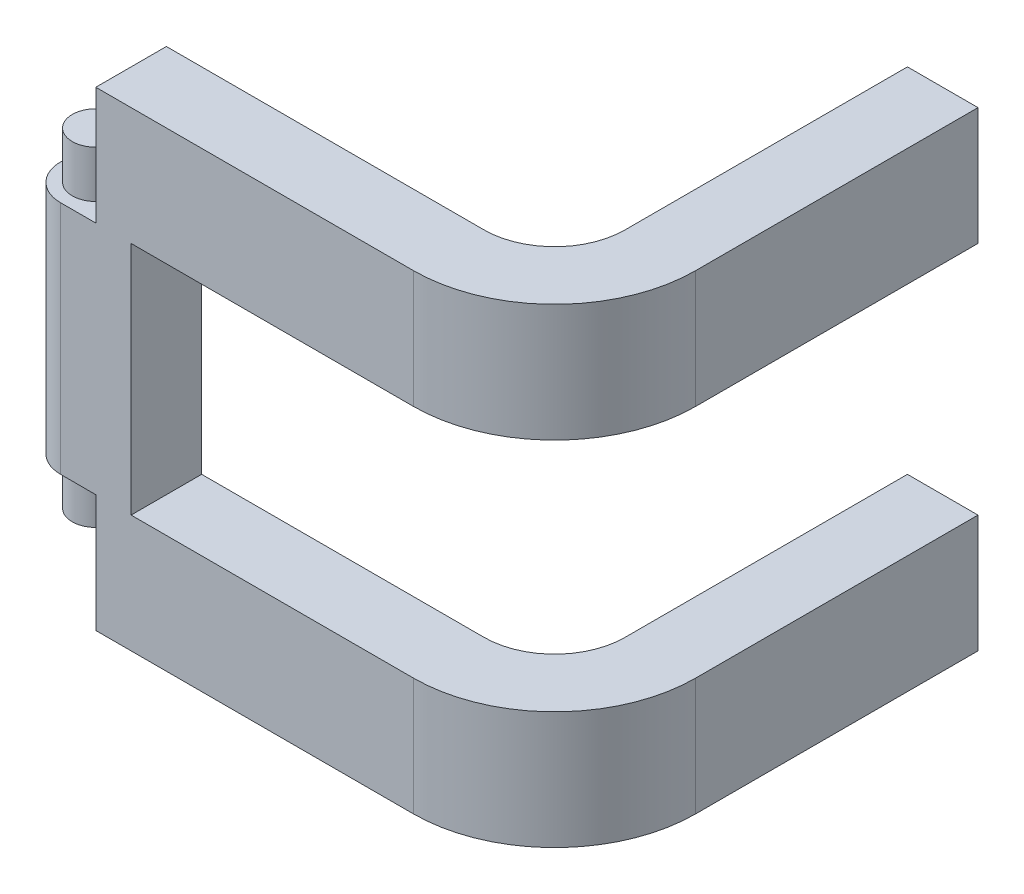
ISO-10303-21;
HEADER;
FILE_DESCRIPTION(('STEP AP214'),'2;1');
FILE_NAME('part.step','',(''),(''),'','','');
FILE_SCHEMA(('AUTOMOTIVE_DESIGN { 1 0 10303 214 1 1 1 1 }'));
ENDSEC;
DATA;
#1=APPLICATION_CONTEXT('core data for automotive mechanical design processes');
#2=APPLICATION_PROTOCOL_DEFINITION('international standard','automotive_design',2000,#1);
#3=PRODUCT_CONTEXT('',#1,'mechanical');
#4=PRODUCT('Part','Part','',(#3));
#5=PRODUCT_RELATED_PRODUCT_CATEGORY('part','',(#4));
#6=PRODUCT_DEFINITION_FORMATION('','',#4);
#7=PRODUCT_DEFINITION_CONTEXT('part definition',#1,'design');
#8=PRODUCT_DEFINITION('design','',#6,#7);
#9=PRODUCT_DEFINITION_SHAPE('','',#8);
#10=(LENGTH_UNIT() NAMED_UNIT(*) SI_UNIT(.MILLI.,.METRE.));
#11=(NAMED_UNIT(*) PLANE_ANGLE_UNIT() SI_UNIT($,.RADIAN.));
#12=(NAMED_UNIT(*) SI_UNIT($,.STERADIAN.) SOLID_ANGLE_UNIT());
#13=UNCERTAINTY_MEASURE_WITH_UNIT(LENGTH_MEASURE(1.E-05),#10,'distance_accuracy_value','');
#14=(GEOMETRIC_REPRESENTATION_CONTEXT(3) GLOBAL_UNCERTAINTY_ASSIGNED_CONTEXT((#13)) GLOBAL_UNIT_ASSIGNED_CONTEXT((#10,
#11,#12)) REPRESENTATION_CONTEXT('',''));
#15=CARTESIAN_POINT('',(0.,0.,0.));
#16=DIRECTION('',(0.,0.,1.));
#17=DIRECTION('',(1.,0.,0.));
#18=AXIS2_PLACEMENT_3D('',#15,#16,#17);
#19=CARTESIAN_POINT('',(0.,50.,0.));
#20=DIRECTION('',(0.,-1.,0.));
#21=DIRECTION('',(0.,0.,-1.));
#22=AXIS2_PLACEMENT_3D('',#19,#20,#21);
#23=CYLINDRICAL_SURFACE('',#22,7.5);
#24=CARTESIAN_POINT('',(0.,-25.,0.));
#25=DIRECTION('',(0.,1.,0.));
#26=DIRECTION('',(0.,0.,1.));
#27=AXIS2_PLACEMENT_3D('',#24,#25,#26);
#28=CIRCLE('',#27,7.5);
#29=CARTESIAN_POINT('',(0.,-25.,-7.5));
#30=VERTEX_POINT('',#29);
#31=CARTESIAN_POINT('',(0.,-25.,7.5));
#32=VERTEX_POINT('',#31);
#33=EDGE_CURVE('E177',#30,#32,#28,.T.);
#34=ORIENTED_EDGE('',*,*,#33,.T.);
#35=DIRECTION('',(0.,-1.,0.));
#36=VECTOR('',#35,1.);
#37=CARTESIAN_POINT('',(0.,50.,7.5));
#38=LINE('',#37,#36);
#39=CARTESIAN_POINT('',(0.,25.,7.5));
#40=VERTEX_POINT('',#39);
#41=EDGE_CURVE('E245',#40,#32,#38,.T.);
#42=ORIENTED_EDGE('',*,*,#41,.F.);
#43=CARTESIAN_POINT('',(0.,25.,0.));
#44=DIRECTION('',(0.,1.,0.));
#45=DIRECTION('',(0.,0.,1.));
#46=AXIS2_PLACEMENT_3D('',#43,#44,#45);
#47=CIRCLE('',#46,7.5);
#48=CARTESIAN_POINT('',(0.,25.,-7.5));
#49=VERTEX_POINT('',#48);
#50=EDGE_CURVE('E202',#49,#40,#47,.T.);
#51=ORIENTED_EDGE('',*,*,#50,.F.);
#52=DIRECTION('',(0.,-1.,0.));
#53=VECTOR('',#52,1.);
#54=CARTESIAN_POINT('',(0.,50.,-7.5));
#55=LINE('',#54,#53);
#56=EDGE_CURVE('E196',#49,#30,#55,.T.);
#57=ORIENTED_EDGE('',*,*,#56,.T.);
#58=EDGE_LOOP('',(#34,#42,#51,#57));
#59=FACE_BOUND('',#58,.T.);
#60=ADVANCED_FACE('F41',(#59),#23,.T.);
#61=CARTESIAN_POINT('',(0.,50.,7.5));
#62=DIRECTION('',(0.,0.,-1.));
#63=DIRECTION('',(-1.,0.,0.));
#64=AXIS2_PLACEMENT_3D('',#61,#62,#63);
#65=PLANE('',#64);
#66=DIRECTION('',(1.,0.,0.));
#67=VECTOR('',#66,1.);
#68=CARTESIAN_POINT('',(7.5,-25.,7.5));
#69=LINE('',#68,#67);
#70=CARTESIAN_POINT('',(7.5,-25.,7.5));
#71=VERTEX_POINT('',#70);
#72=EDGE_CURVE('E184',#32,#71,#69,.T.);
#73=ORIENTED_EDGE('',*,*,#72,.T.);
#74=DIRECTION('',(0.,-1.,0.));
#75=VECTOR('',#74,1.);
#76=CARTESIAN_POINT('',(7.5,-35.,7.5));
#77=LINE('',#76,#75);
#78=CARTESIAN_POINT('',(7.5,-50.,7.5));
#79=VERTEX_POINT('',#78);
#80=EDGE_CURVE('E370',#71,#79,#77,.T.);
#81=ORIENTED_EDGE('',*,*,#80,.T.);
#82=DIRECTION('',(1.,0.,0.));
#83=VECTOR('',#82,1.);
#84=CARTESIAN_POINT('',(0.,-50.,7.5));
#85=LINE('',#84,#83);
#86=CARTESIAN_POINT('',(75.,-50.,7.5));
#87=VERTEX_POINT('',#86);
#88=EDGE_CURVE('E316',#79,#87,#85,.T.);
#89=ORIENTED_EDGE('',*,*,#88,.T.);
#90=DIRECTION('',(0.,-1.,0.));
#91=VECTOR('',#90,1.);
#92=CARTESIAN_POINT('',(75.,50.,7.5));
#93=LINE('',#92,#91);
#94=CARTESIAN_POINT('',(75.,-25.,7.5));
#95=VERTEX_POINT('',#94);
#96=EDGE_CURVE('E240',#95,#87,#93,.T.);
#97=ORIENTED_EDGE('',*,*,#96,.F.);
#98=DIRECTION('',(1.,0.,0.));
#99=VECTOR('',#98,1.);
#100=CARTESIAN_POINT('',(0.,-25.,7.5));
#101=LINE('',#100,#99);
#102=CARTESIAN_POINT('',(15.,-25.,7.5));
#103=VERTEX_POINT('',#102);
#104=EDGE_CURVE('E293',#103,#95,#101,.T.);
#105=ORIENTED_EDGE('',*,*,#104,.F.);
#106=DIRECTION('',(0.,1.,0.));
#107=VECTOR('',#106,1.);
#108=CARTESIAN_POINT('',(15.,50.,7.5));
#109=LINE('',#108,#107);
#110=CARTESIAN_POINT('',(15.,25.,7.5));
#111=VERTEX_POINT('',#110);
#112=EDGE_CURVE('E313',#103,#111,#109,.T.);
#113=ORIENTED_EDGE('',*,*,#112,.T.);
#114=DIRECTION('',(-1.,0.,0.));
#115=VECTOR('',#114,1.);
#116=CARTESIAN_POINT('',(0.,25.,7.5));
#117=LINE('',#116,#115);
#118=CARTESIAN_POINT('',(75.,25.,7.5));
#119=VERTEX_POINT('',#118);
#120=EDGE_CURVE('E268',#119,#111,#117,.T.);
#121=ORIENTED_EDGE('',*,*,#120,.F.);
#122=CARTESIAN_POINT('',(75.,50.,7.5));
#123=VERTEX_POINT('',#122);
#124=EDGE_CURVE('E241',#123,#119,#93,.T.);
#125=ORIENTED_EDGE('',*,*,#124,.F.);
#126=DIRECTION('',(1.,0.,0.));
#127=VECTOR('',#126,1.);
#128=CARTESIAN_POINT('',(0.,50.,7.5));
#129=LINE('',#128,#127);
#130=CARTESIAN_POINT('',(7.5,50.,7.5));
#131=VERTEX_POINT('',#130);
#132=EDGE_CURVE('E317',#131,#123,#129,.T.);
#133=ORIENTED_EDGE('',*,*,#132,.F.);
#134=DIRECTION('',(0.,1.,0.));
#135=VECTOR('',#134,1.);
#136=CARTESIAN_POINT('',(7.5,35.,7.5));
#137=LINE('',#136,#135);
#138=CARTESIAN_POINT('',(7.5,25.,7.5));
#139=VERTEX_POINT('',#138);
#140=EDGE_CURVE('E64',#139,#131,#137,.T.);
#141=ORIENTED_EDGE('',*,*,#140,.F.);
#142=DIRECTION('',(1.,0.,0.));
#143=VECTOR('',#142,1.);
#144=CARTESIAN_POINT('',(7.5,25.,7.5));
#145=LINE('',#144,#143);
#146=EDGE_CURVE('E419',#40,#139,#145,.T.);
#147=ORIENTED_EDGE('',*,*,#146,.F.);
#148=ORIENTED_EDGE('',*,*,#41,.T.);
#149=EDGE_LOOP('',(#73,#81,#89,#97,#105,#113,#121,#125,#133,#141,#147,#148));
#150=FACE_BOUND('',#149,.T.);
#151=ADVANCED_FACE('F388',(#150),#65,.F.);
#152=CARTESIAN_POINT('',(0.,50.,-7.5));
#153=DIRECTION('',(0.,0.,1.));
#154=DIRECTION('',(1.,0.,0.));
#155=AXIS2_PLACEMENT_3D('',#152,#153,#154);
#156=PLANE('',#155);
#157=DIRECTION('',(-1.,0.,0.));
#158=VECTOR('',#157,1.);
#159=CARTESIAN_POINT('',(0.,-25.,-7.5));
#160=LINE('',#159,#158);
#161=CARTESIAN_POINT('',(7.5,-25.,-7.5));
#162=VERTEX_POINT('',#161);
#163=EDGE_CURVE('E182',#162,#30,#160,.T.);
#164=ORIENTED_EDGE('',*,*,#163,.T.);
#165=ORIENTED_EDGE('',*,*,#56,.F.);
#166=DIRECTION('',(-1.,0.,0.));
#167=VECTOR('',#166,1.);
#168=CARTESIAN_POINT('',(0.,25.,-7.5));
#169=LINE('',#168,#167);
#170=CARTESIAN_POINT('',(7.5,25.,-7.5));
#171=VERTEX_POINT('',#170);
#172=EDGE_CURVE('E366',#171,#49,#169,.T.);
#173=ORIENTED_EDGE('',*,*,#172,.F.);
#174=DIRECTION('',(0.,1.,0.));
#175=VECTOR('',#174,1.);
#176=CARTESIAN_POINT('',(7.49999999999999,35.,-7.5));
#177=LINE('',#176,#175);
#178=CARTESIAN_POINT('',(7.49999999999999,50.,-7.5));
#179=VERTEX_POINT('',#178);
#180=EDGE_CURVE('E270',#171,#179,#177,.T.);
#181=ORIENTED_EDGE('',*,*,#180,.T.);
#182=DIRECTION('',(-1.,0.,0.));
#183=VECTOR('',#182,1.);
#184=CARTESIAN_POINT('',(0.,50.,-7.5));
#185=LINE('',#184,#183);
#186=CARTESIAN_POINT('',(75.,50.,-7.5));
#187=VERTEX_POINT('',#186);
#188=EDGE_CURVE('E205',#187,#179,#185,.T.);
#189=ORIENTED_EDGE('',*,*,#188,.F.);
#190=DIRECTION('',(0.,-1.,0.));
#191=VECTOR('',#190,1.);
#192=CARTESIAN_POINT('',(75.,50.,-7.5));
#193=LINE('',#192,#191);
#194=CARTESIAN_POINT('',(75.,25.,-7.5));
#195=VERTEX_POINT('',#194);
#196=EDGE_CURVE('E209',#187,#195,#193,.T.);
#197=ORIENTED_EDGE('',*,*,#196,.T.);
#198=DIRECTION('',(1.,0.,0.));
#199=VECTOR('',#198,1.);
#200=CARTESIAN_POINT('',(0.,25.,-7.5));
#201=LINE('',#200,#199);
#202=CARTESIAN_POINT('',(15.,25.,-7.5));
#203=VERTEX_POINT('',#202);
#204=EDGE_CURVE('E11',#203,#195,#201,.T.);
#205=ORIENTED_EDGE('',*,*,#204,.F.);
#206=DIRECTION('',(0.,-1.,0.));
#207=VECTOR('',#206,1.);
#208=CARTESIAN_POINT('',(15.,50.,-7.5));
#209=LINE('',#208,#207);
#210=CARTESIAN_POINT('',(15.,-25.,-7.5));
#211=VERTEX_POINT('',#210);
#212=EDGE_CURVE('E49',#203,#211,#209,.T.);
#213=ORIENTED_EDGE('',*,*,#212,.T.);
#214=DIRECTION('',(-1.,0.,0.));
#215=VECTOR('',#214,1.);
#216=CARTESIAN_POINT('',(0.,-25.,-7.5));
#217=LINE('',#216,#215);
#218=CARTESIAN_POINT('',(75.,-25.,-7.5));
#219=VERTEX_POINT('',#218);
#220=EDGE_CURVE('E248',#219,#211,#217,.T.);
#221=ORIENTED_EDGE('',*,*,#220,.F.);
#222=CARTESIAN_POINT('',(75.,-50.,-7.5));
#223=VERTEX_POINT('',#222);
#224=EDGE_CURVE('E204',#219,#223,#193,.T.);
#225=ORIENTED_EDGE('',*,*,#224,.T.);
#226=DIRECTION('',(-1.,0.,0.));
#227=VECTOR('',#226,1.);
#228=CARTESIAN_POINT('',(0.,-50.,-7.5));
#229=LINE('',#228,#227);
#230=CARTESIAN_POINT('',(7.49999999999999,-50.,-7.5));
#231=VERTEX_POINT('',#230);
#232=EDGE_CURVE('E215',#223,#231,#229,.T.);
#233=ORIENTED_EDGE('',*,*,#232,.T.);
#234=DIRECTION('',(0.,-1.,0.));
#235=VECTOR('',#234,1.);
#236=CARTESIAN_POINT('',(7.49999999999999,-35.,-7.5));
#237=LINE('',#236,#235);
#238=EDGE_CURVE('E56',#162,#231,#237,.T.);
#239=ORIENTED_EDGE('',*,*,#238,.F.);
#240=EDGE_LOOP('',(#164,#165,#173,#181,#189,#197,#205,#213,#221,#225,#233,#239));
#241=FACE_BOUND('',#240,.T.);
#242=ADVANCED_FACE('F194',(#241),#156,.F.);
#243=CARTESIAN_POINT('',(0.,50.,0.));
#244=DIRECTION('',(0.,1.,0.));
#245=DIRECTION('',(0.,0.,1.));
#246=AXIS2_PLACEMENT_3D('',#243,#244,#245);
#247=PLANE('',#246);
#248=ORIENTED_EDGE('',*,*,#188,.T.);
#249=DIRECTION('',(0.,0.,1.));
#250=VECTOR('',#249,1.);
#251=CARTESIAN_POINT('',(7.49999999999999,50.,-7.5));
#252=LINE('',#251,#250);
#253=EDGE_CURVE('E378',#179,#131,#252,.T.);
#254=ORIENTED_EDGE('',*,*,#253,.T.);
#255=ORIENTED_EDGE('',*,*,#132,.T.);
#256=CARTESIAN_POINT('',(75.,50.,-22.5));
#257=DIRECTION('',(0.,1.,0.));
#258=DIRECTION('',(0.,0.,1.));
#259=AXIS2_PLACEMENT_3D('',#256,#257,#258);
#260=CIRCLE('',#259,30.);
#261=CARTESIAN_POINT('',(105.,50.,-22.5));
#262=VERTEX_POINT('',#261);
#263=EDGE_CURVE('E320',#123,#262,#260,.T.);
#264=ORIENTED_EDGE('',*,*,#263,.T.);
#265=DIRECTION('',(0.,0.,-1.));
#266=VECTOR('',#265,1.);
#267=CARTESIAN_POINT('',(105.,50.,-22.5));
#268=LINE('',#267,#266);
#269=CARTESIAN_POINT('',(105.,50.,-82.5));
#270=VERTEX_POINT('',#269);
#271=EDGE_CURVE('E323',#262,#270,#268,.T.);
#272=ORIENTED_EDGE('',*,*,#271,.T.);
#273=DIRECTION('',(-1.,0.,0.));
#274=VECTOR('',#273,1.);
#275=CARTESIAN_POINT('',(90.,50.,-82.5));
#276=LINE('',#275,#274);
#277=CARTESIAN_POINT('',(90.,50.,-82.5));
#278=VERTEX_POINT('',#277);
#279=EDGE_CURVE('E326',#270,#278,#276,.T.);
#280=ORIENTED_EDGE('',*,*,#279,.T.);
#281=DIRECTION('',(0.,0.,1.));
#282=VECTOR('',#281,1.);
#283=CARTESIAN_POINT('',(90.,50.,-22.5));
#284=LINE('',#283,#282);
#285=CARTESIAN_POINT('',(90.,50.,-22.5));
#286=VERTEX_POINT('',#285);
#287=EDGE_CURVE('E329',#278,#286,#284,.T.);
#288=ORIENTED_EDGE('',*,*,#287,.T.);
#289=CARTESIAN_POINT('',(75.,50.,-22.5));
#290=DIRECTION('',(0.,-1.,0.));
#291=DIRECTION('',(0.,0.,1.));
#292=AXIS2_PLACEMENT_3D('',#289,#290,#291);
#293=CIRCLE('',#292,15.);
#294=EDGE_CURVE('E212',#286,#187,#293,.T.);
#295=ORIENTED_EDGE('',*,*,#294,.T.);
#296=EDGE_LOOP('',(#248,#254,#255,#264,#272,#280,#288,#295));
#297=FACE_BOUND('',#296,.T.);
#298=ADVANCED_FACE('F384',(#297),#247,.T.);
#299=CARTESIAN_POINT('',(75.,50.,-22.5));
#300=DIRECTION('',(0.,-1.,0.));
#301=DIRECTION('',(0.,0.,-1.));
#302=AXIS2_PLACEMENT_3D('',#299,#300,#301);
#303=CYLINDRICAL_SURFACE('',#302,30.);
#304=CARTESIAN_POINT('',(75.,25.,-22.5));
#305=DIRECTION('',(0.,-1.,0.));
#306=DIRECTION('',(0.,0.,-1.));
#307=AXIS2_PLACEMENT_3D('',#304,#305,#306);
#308=CIRCLE('',#307,30.);
#309=CARTESIAN_POINT('',(105.,25.,-22.5));
#310=VERTEX_POINT('',#309);
#311=EDGE_CURVE('E308',#310,#119,#308,.T.);
#312=ORIENTED_EDGE('',*,*,#311,.F.);
#313=DIRECTION('',(0.,-1.,0.));
#314=VECTOR('',#313,1.);
#315=CARTESIAN_POINT('',(105.,50.,-22.5));
#316=LINE('',#315,#314);
#317=EDGE_CURVE('E236',#262,#310,#316,.T.);
#318=ORIENTED_EDGE('',*,*,#317,.F.);
#319=ORIENTED_EDGE('',*,*,#263,.F.);
#320=ORIENTED_EDGE('',*,*,#124,.T.);
#321=EDGE_LOOP('',(#312,#318,#319,#320));
#322=FACE_BOUND('',#321,.T.);
#323=ADVANCED_FACE('F394',(#322),#303,.T.);
#324=CARTESIAN_POINT('',(75.,-25.,-22.5));
#325=DIRECTION('',(0.,1.,0.));
#326=DIRECTION('',(0.,0.,1.));
#327=AXIS2_PLACEMENT_3D('',#324,#325,#326);
#328=CIRCLE('',#327,30.);
#329=CARTESIAN_POINT('',(105.,-25.,-22.5));
#330=VERTEX_POINT('',#329);
#331=EDGE_CURVE('E290',#95,#330,#328,.T.);
#332=ORIENTED_EDGE('',*,*,#331,.F.);
#333=ORIENTED_EDGE('',*,*,#96,.T.);
#334=CARTESIAN_POINT('',(75.,-50.,-22.5));
#335=DIRECTION('',(0.,1.,0.));
#336=DIRECTION('',(0.,0.,1.));
#337=AXIS2_PLACEMENT_3D('',#334,#335,#336);
#338=CIRCLE('',#337,30.);
#339=CARTESIAN_POINT('',(105.,-50.,-22.5));
#340=VERTEX_POINT('',#339);
#341=EDGE_CURVE('E336',#87,#340,#338,.T.);
#342=ORIENTED_EDGE('',*,*,#341,.T.);
#343=EDGE_CURVE('E235',#330,#340,#316,.T.);
#344=ORIENTED_EDGE('',*,*,#343,.F.);
#345=EDGE_LOOP('',(#332,#333,#342,#344));
#346=FACE_BOUND('',#345,.T.);
#347=ADVANCED_FACE('F470',(#346),#303,.T.);
#348=CARTESIAN_POINT('',(105.,50.,-22.5));
#349=DIRECTION('',(-1.,0.,0.));
#350=DIRECTION('',(0.,0.,1.));
#351=AXIS2_PLACEMENT_3D('',#348,#349,#350);
#352=PLANE('',#351);
#353=DIRECTION('',(0.,0.,1.));
#354=VECTOR('',#353,1.);
#355=CARTESIAN_POINT('',(105.,25.,-22.5));
#356=LINE('',#355,#354);
#357=CARTESIAN_POINT('',(105.,25.,-82.5));
#358=VERTEX_POINT('',#357);
#359=EDGE_CURVE('E305',#358,#310,#356,.T.);
#360=ORIENTED_EDGE('',*,*,#359,.F.);
#361=DIRECTION('',(0.,-1.,0.));
#362=VECTOR('',#361,1.);
#363=CARTESIAN_POINT('',(105.,50.,-82.5));
#364=LINE('',#363,#362);
#365=EDGE_CURVE('E231',#270,#358,#364,.T.);
#366=ORIENTED_EDGE('',*,*,#365,.F.);
#367=ORIENTED_EDGE('',*,*,#271,.F.);
#368=ORIENTED_EDGE('',*,*,#317,.T.);
#369=EDGE_LOOP('',(#360,#366,#367,#368));
#370=FACE_BOUND('',#369,.T.);
#371=ADVANCED_FACE('F401',(#370),#352,.F.);
#372=DIRECTION('',(0.,0.,-1.));
#373=VECTOR('',#372,1.);
#374=CARTESIAN_POINT('',(105.,-25.,-22.5));
#375=LINE('',#374,#373);
#376=CARTESIAN_POINT('',(105.,-25.,-82.5));
#377=VERTEX_POINT('',#376);
#378=EDGE_CURVE('E287',#330,#377,#375,.T.);
#379=ORIENTED_EDGE('',*,*,#378,.F.);
#380=ORIENTED_EDGE('',*,*,#343,.T.);
#381=DIRECTION('',(0.,0.,-1.));
#382=VECTOR('',#381,1.);
#383=CARTESIAN_POINT('',(105.,-50.,-22.5));
#384=LINE('',#383,#382);
#385=CARTESIAN_POINT('',(105.,-50.,-82.5));
#386=VERTEX_POINT('',#385);
#387=EDGE_CURVE('E340',#340,#386,#384,.T.);
#388=ORIENTED_EDGE('',*,*,#387,.T.);
#389=EDGE_CURVE('E230',#377,#386,#364,.T.);
#390=ORIENTED_EDGE('',*,*,#389,.F.);
#391=EDGE_LOOP('',(#379,#380,#388,#390));
#392=FACE_BOUND('',#391,.T.);
#393=ADVANCED_FACE('F473',(#392),#352,.F.);
#394=CARTESIAN_POINT('',(90.,50.,-82.5));
#395=DIRECTION('',(0.,0.,1.));
#396=DIRECTION('',(1.,0.,0.));
#397=AXIS2_PLACEMENT_3D('',#394,#395,#396);
#398=PLANE('',#397);
#399=DIRECTION('',(1.,0.,0.));
#400=VECTOR('',#399,1.);
#401=CARTESIAN_POINT('',(90.,25.,-82.5));
#402=LINE('',#401,#400);
#403=CARTESIAN_POINT('',(90.,25.,-82.5));
#404=VERTEX_POINT('',#403);
#405=EDGE_CURVE('E302',#404,#358,#402,.T.);
#406=ORIENTED_EDGE('',*,*,#405,.F.);
#407=DIRECTION('',(0.,-1.,0.));
#408=VECTOR('',#407,1.);
#409=CARTESIAN_POINT('',(90.,50.,-82.5));
#410=LINE('',#409,#408);
#411=EDGE_CURVE('E226',#278,#404,#410,.T.);
#412=ORIENTED_EDGE('',*,*,#411,.F.);
#413=ORIENTED_EDGE('',*,*,#279,.F.);
#414=ORIENTED_EDGE('',*,*,#365,.T.);
#415=EDGE_LOOP('',(#406,#412,#413,#414));
#416=FACE_BOUND('',#415,.T.);
#417=ADVANCED_FACE('F404',(#416),#398,.F.);
#418=DIRECTION('',(-1.,0.,0.));
#419=VECTOR('',#418,1.);
#420=CARTESIAN_POINT('',(90.,-25.,-82.5));
#421=LINE('',#420,#419);
#422=CARTESIAN_POINT('',(90.,-25.,-82.5));
#423=VERTEX_POINT('',#422);
#424=EDGE_CURVE('E284',#377,#423,#421,.T.);
#425=ORIENTED_EDGE('',*,*,#424,.F.);
#426=ORIENTED_EDGE('',*,*,#389,.T.);
#427=DIRECTION('',(-1.,0.,0.));
#428=VECTOR('',#427,1.);
#429=CARTESIAN_POINT('',(90.,-50.,-82.5));
#430=LINE('',#429,#428);
#431=CARTESIAN_POINT('',(90.,-50.,-82.5));
#432=VERTEX_POINT('',#431);
#433=EDGE_CURVE('E344',#386,#432,#430,.T.);
#434=ORIENTED_EDGE('',*,*,#433,.T.);
#435=EDGE_CURVE('E225',#423,#432,#410,.T.);
#436=ORIENTED_EDGE('',*,*,#435,.F.);
#437=EDGE_LOOP('',(#425,#426,#434,#436));
#438=FACE_BOUND('',#437,.T.);
#439=ADVANCED_FACE('F476',(#438),#398,.F.);
#440=CARTESIAN_POINT('',(90.,50.,-22.5));
#441=DIRECTION('',(1.,0.,0.));
#442=DIRECTION('',(0.,0.,-1.));
#443=AXIS2_PLACEMENT_3D('',#440,#441,#442);
#444=PLANE('',#443);
#445=DIRECTION('',(0.,0.,-1.));
#446=VECTOR('',#445,1.);
#447=CARTESIAN_POINT('',(90.,25.,-22.5));
#448=LINE('',#447,#446);
#449=CARTESIAN_POINT('',(90.,25.,-22.5));
#450=VERTEX_POINT('',#449);
#451=EDGE_CURVE('E299',#450,#404,#448,.T.);
#452=ORIENTED_EDGE('',*,*,#451,.F.);
#453=DIRECTION('',(0.,-1.,0.));
#454=VECTOR('',#453,1.);
#455=CARTESIAN_POINT('',(90.,50.,-22.5));
#456=LINE('',#455,#454);
#457=EDGE_CURVE('E221',#286,#450,#456,.T.);
#458=ORIENTED_EDGE('',*,*,#457,.F.);
#459=ORIENTED_EDGE('',*,*,#287,.F.);
#460=ORIENTED_EDGE('',*,*,#411,.T.);
#461=EDGE_LOOP('',(#452,#458,#459,#460));
#462=FACE_BOUND('',#461,.T.);
#463=ADVANCED_FACE('F409',(#462),#444,.F.);
#464=DIRECTION('',(0.,0.,1.));
#465=VECTOR('',#464,1.);
#466=CARTESIAN_POINT('',(90.,-25.,-22.5));
#467=LINE('',#466,#465);
#468=CARTESIAN_POINT('',(90.,-25.,-22.5));
#469=VERTEX_POINT('',#468);
#470=EDGE_CURVE('E281',#423,#469,#467,.T.);
#471=ORIENTED_EDGE('',*,*,#470,.F.);
#472=ORIENTED_EDGE('',*,*,#435,.T.);
#473=DIRECTION('',(0.,0.,1.));
#474=VECTOR('',#473,1.);
#475=CARTESIAN_POINT('',(90.,-50.,-22.5));
#476=LINE('',#475,#474);
#477=CARTESIAN_POINT('',(90.,-50.,-22.5));
#478=VERTEX_POINT('',#477);
#479=EDGE_CURVE('E348',#432,#478,#476,.T.);
#480=ORIENTED_EDGE('',*,*,#479,.T.);
#481=EDGE_CURVE('E220',#469,#478,#456,.T.);
#482=ORIENTED_EDGE('',*,*,#481,.F.);
#483=EDGE_LOOP('',(#471,#472,#480,#482));
#484=FACE_BOUND('',#483,.T.);
#485=ADVANCED_FACE('F479',(#484),#444,.F.);
#486=CARTESIAN_POINT('',(75.,50.,-22.5));
#487=DIRECTION('',(0.,-1.,0.));
#488=DIRECTION('',(0.,0.,-1.));
#489=AXIS2_PLACEMENT_3D('',#486,#487,#488);
#490=CYLINDRICAL_SURFACE('',#489,15.);
#491=CARTESIAN_POINT('',(75.,25.,-22.5));
#492=DIRECTION('',(0.,-1.,0.));
#493=DIRECTION('',(0.,0.,-1.));
#494=AXIS2_PLACEMENT_3D('',#491,#492,#493);
#495=CIRCLE('',#494,15.);
#496=EDGE_CURVE('E296',#195,#450,#495,.F.);
#497=ORIENTED_EDGE('',*,*,#496,.F.);
#498=ORIENTED_EDGE('',*,*,#196,.F.);
#499=ORIENTED_EDGE('',*,*,#294,.F.);
#500=ORIENTED_EDGE('',*,*,#457,.T.);
#501=EDGE_LOOP('',(#497,#498,#499,#500));
#502=FACE_BOUND('',#501,.T.);
#503=ADVANCED_FACE('F413',(#502),#490,.F.);
#504=CARTESIAN_POINT('',(75.,-25.,-22.5));
#505=DIRECTION('',(0.,1.,0.));
#506=DIRECTION('',(0.,0.,1.));
#507=AXIS2_PLACEMENT_3D('',#504,#505,#506);
#508=CIRCLE('',#507,15.);
#509=EDGE_CURVE('E274',#469,#219,#508,.F.);
#510=ORIENTED_EDGE('',*,*,#509,.F.);
#511=ORIENTED_EDGE('',*,*,#481,.T.);
#512=CARTESIAN_POINT('',(75.,-50.,-22.5));
#513=DIRECTION('',(0.,-1.,0.));
#514=DIRECTION('',(0.,0.,1.));
#515=AXIS2_PLACEMENT_3D('',#512,#513,#514);
#516=CIRCLE('',#515,15.);
#517=EDGE_CURVE('E351',#478,#223,#516,.T.);
#518=ORIENTED_EDGE('',*,*,#517,.T.);
#519=ORIENTED_EDGE('',*,*,#224,.F.);
#520=EDGE_LOOP('',(#510,#511,#518,#519));
#521=FACE_BOUND('',#520,.T.);
#522=ADVANCED_FACE('F481',(#521),#490,.F.);
#523=CARTESIAN_POINT('',(0.,-50.,0.));
#524=DIRECTION('',(0.,1.,0.));
#525=DIRECTION('',(0.,0.,1.));
#526=AXIS2_PLACEMENT_3D('',#523,#524,#525);
#527=PLANE('',#526);
#528=ORIENTED_EDGE('',*,*,#88,.F.);
#529=DIRECTION('',(0.,0.,1.));
#530=VECTOR('',#529,1.);
#531=CARTESIAN_POINT('',(7.49999999999999,-50.,-7.5));
#532=LINE('',#531,#530);
#533=EDGE_CURVE('E362',#231,#79,#532,.T.);
#534=ORIENTED_EDGE('',*,*,#533,.F.);
#535=ORIENTED_EDGE('',*,*,#232,.F.);
#536=ORIENTED_EDGE('',*,*,#517,.F.);
#537=ORIENTED_EDGE('',*,*,#479,.F.);
#538=ORIENTED_EDGE('',*,*,#433,.F.);
#539=ORIENTED_EDGE('',*,*,#387,.F.);
#540=ORIENTED_EDGE('',*,*,#341,.F.);
#541=EDGE_LOOP('',(#528,#534,#535,#536,#537,#538,#539,#540));
#542=FACE_BOUND('',#541,.T.);
#543=ADVANCED_FACE('F360',(#542),#527,.F.);
#544=CARTESIAN_POINT('',(15.,-166.270066978979,10.9240516039639));
#545=DIRECTION('',(-1.,0.,0.));
#546=DIRECTION('',(0.,0.,1.));
#547=AXIS2_PLACEMENT_3D('',#544,#545,#546);
#548=PLANE('',#547);
#549=DIRECTION('',(0.,0.,-1.));
#550=VECTOR('',#549,1.);
#551=CARTESIAN_POINT('',(15.,-25.,10.9240516039639));
#552=LINE('',#551,#550);
#553=EDGE_CURVE('E263',#103,#211,#552,.T.);
#554=ORIENTED_EDGE('',*,*,#553,.T.);
#555=ORIENTED_EDGE('',*,*,#212,.F.);
#556=DIRECTION('',(0.,0.,1.));
#557=VECTOR('',#556,1.);
#558=CARTESIAN_POINT('',(15.,25.,10.9240516039639));
#559=LINE('',#558,#557);
#560=EDGE_CURVE('E260',#203,#111,#559,.T.);
#561=ORIENTED_EDGE('',*,*,#560,.T.);
#562=ORIENTED_EDGE('',*,*,#112,.F.);
#563=EDGE_LOOP('',(#554,#555,#561,#562));
#564=FACE_BOUND('',#563,.T.);
#565=ADVANCED_FACE('F259',(#564),#548,.F.);
#566=CARTESIAN_POINT('',(0.,25.,0.));
#567=DIRECTION('',(0.,-1.,0.));
#568=DIRECTION('',(0.,0.,-1.));
#569=AXIS2_PLACEMENT_3D('',#566,#567,#568);
#570=PLANE('',#569);
#571=ORIENTED_EDGE('',*,*,#120,.T.);
#572=ORIENTED_EDGE('',*,*,#560,.F.);
#573=ORIENTED_EDGE('',*,*,#204,.T.);
#574=ORIENTED_EDGE('',*,*,#496,.T.);
#575=ORIENTED_EDGE('',*,*,#451,.T.);
#576=ORIENTED_EDGE('',*,*,#405,.T.);
#577=ORIENTED_EDGE('',*,*,#359,.T.);
#578=ORIENTED_EDGE('',*,*,#311,.T.);
#579=EDGE_LOOP('',(#571,#572,#573,#574,#575,#576,#577,#578));
#580=FACE_BOUND('',#579,.T.);
#581=ADVANCED_FACE('F265',(#580),#570,.T.);
#582=CARTESIAN_POINT('',(0.,-25.,0.));
#583=DIRECTION('',(0.,1.,0.));
#584=DIRECTION('',(0.,0.,1.));
#585=AXIS2_PLACEMENT_3D('',#582,#583,#584);
#586=PLANE('',#585);
#587=ORIENTED_EDGE('',*,*,#104,.T.);
#588=ORIENTED_EDGE('',*,*,#331,.T.);
#589=ORIENTED_EDGE('',*,*,#378,.T.);
#590=ORIENTED_EDGE('',*,*,#424,.T.);
#591=ORIENTED_EDGE('',*,*,#470,.T.);
#592=ORIENTED_EDGE('',*,*,#509,.T.);
#593=ORIENTED_EDGE('',*,*,#220,.T.);
#594=ORIENTED_EDGE('',*,*,#553,.F.);
#595=EDGE_LOOP('',(#587,#588,#589,#590,#591,#592,#593,#594));
#596=FACE_BOUND('',#595,.T.);
#597=ADVANCED_FACE('F491',(#596),#586,.T.);
#598=CARTESIAN_POINT('',(7.49999999999999,35.,-7.5));
#599=DIRECTION('',(-1.,0.,0.));
#600=DIRECTION('',(0.,0.,1.));
#601=AXIS2_PLACEMENT_3D('',#598,#599,#600);
#602=PLANE('',#601);
#603=ORIENTED_EDGE('',*,*,#253,.F.);
#604=ORIENTED_EDGE('',*,*,#180,.F.);
#605=DIRECTION('',(0.,0.,-1.));
#606=VECTOR('',#605,1.);
#607=CARTESIAN_POINT('',(7.5,25.,-7.5));
#608=LINE('',#607,#606);
#609=EDGE_CURVE('E372',#139,#171,#608,.T.);
#610=ORIENTED_EDGE('',*,*,#609,.F.);
#611=ORIENTED_EDGE('',*,*,#140,.T.);
#612=EDGE_LOOP('',(#603,#604,#610,#611));
#613=FACE_BOUND('',#612,.T.);
#614=ADVANCED_FACE('F415',(#613),#602,.T.);
#615=CARTESIAN_POINT('',(7.49999999999999,-35.,-7.5));
#616=DIRECTION('',(1.,0.,0.));
#617=DIRECTION('',(0.,0.,-1.));
#618=AXIS2_PLACEMENT_3D('',#615,#616,#617);
#619=PLANE('',#618);
#620=ORIENTED_EDGE('',*,*,#533,.T.);
#621=ORIENTED_EDGE('',*,*,#80,.F.);
#622=DIRECTION('',(0.,0.,-1.));
#623=VECTOR('',#622,1.);
#624=CARTESIAN_POINT('',(7.5,-25.,-7.5));
#625=LINE('',#624,#623);
#626=EDGE_CURVE('E199',#71,#162,#625,.T.);
#627=ORIENTED_EDGE('',*,*,#626,.T.);
#628=ORIENTED_EDGE('',*,*,#238,.T.);
#629=EDGE_LOOP('',(#620,#621,#627,#628));
#630=FACE_BOUND('',#629,.T.);
#631=ADVANCED_FACE('F497',(#630),#619,.F.);
#632=CARTESIAN_POINT('',(0.,25.,0.));
#633=DIRECTION('',(0.,1.,0.));
#634=DIRECTION('',(0.,0.,1.));
#635=AXIS2_PLACEMENT_3D('',#632,#633,#634);
#636=PLANE('',#635);
#637=CARTESIAN_POINT('',(0.,25.,0.));
#638=DIRECTION('',(0.,1.,0.));
#639=DIRECTION('',(0.,0.,1.));
#640=AXIS2_PLACEMENT_3D('',#637,#638,#639);
#641=CIRCLE('',#640,5.);
#642=CARTESIAN_POINT('',(0.,25.,5.));
#643=VERTEX_POINT('',#642);
#644=EDGE_CURVE('E426',#643,#643,#641,.T.);
#645=ORIENTED_EDGE('',*,*,#644,.F.);
#646=EDGE_LOOP('',(#645));
#647=FACE_BOUND('',#646,.T.);
#648=ORIENTED_EDGE('',*,*,#50,.T.);
#649=ORIENTED_EDGE('',*,*,#146,.T.);
#650=ORIENTED_EDGE('',*,*,#609,.T.);
#651=ORIENTED_EDGE('',*,*,#172,.T.);
#652=EDGE_LOOP('',(#648,#649,#650,#651));
#653=FACE_BOUND('',#652,.T.);
#654=ADVANCED_FACE('F418',(#647,#653),#636,.T.);
#655=CARTESIAN_POINT('',(0.,25.,0.));
#656=DIRECTION('',(0.,1.,0.));
#657=DIRECTION('',(0.,0.,1.));
#658=AXIS2_PLACEMENT_3D('',#655,#656,#657);
#659=CYLINDRICAL_SURFACE('',#658,5.);
#660=ORIENTED_EDGE('',*,*,#644,.T.);
#661=EDGE_LOOP('',(#660));
#662=FACE_BOUND('',#661,.T.);
#663=CARTESIAN_POINT('',(0.,35.,0.));
#664=DIRECTION('',(0.,1.,0.));
#665=DIRECTION('',(0.,0.,1.));
#666=AXIS2_PLACEMENT_3D('',#663,#664,#665);
#667=CIRCLE('',#666,5.);
#668=CARTESIAN_POINT('',(0.,35.,5.));
#669=VERTEX_POINT('',#668);
#670=EDGE_CURVE('E427',#669,#669,#667,.T.);
#671=ORIENTED_EDGE('',*,*,#670,.F.);
#672=EDGE_LOOP('',(#671));
#673=FACE_BOUND('',#672,.T.);
#674=ADVANCED_FACE('F500',(#662,#673),#659,.T.);
#675=CARTESIAN_POINT('',(0.,35.,0.));
#676=DIRECTION('',(0.,-1.,0.));
#677=DIRECTION('',(0.,0.,-1.));
#678=AXIS2_PLACEMENT_3D('',#675,#676,#677);
#679=PLANE('',#678);
#680=ORIENTED_EDGE('',*,*,#670,.T.);
#681=EDGE_LOOP('',(#680));
#682=FACE_BOUND('',#681,.T.);
#683=ADVANCED_FACE('F498',(#682),#679,.F.);
#684=CARTESIAN_POINT('',(0.,-25.,0.));
#685=DIRECTION('',(0.,-1.,0.));
#686=DIRECTION('',(0.,0.,1.));
#687=AXIS2_PLACEMENT_3D('',#684,#685,#686);
#688=PLANE('',#687);
#689=ORIENTED_EDGE('',*,*,#33,.F.);
#690=ORIENTED_EDGE('',*,*,#163,.F.);
#691=ORIENTED_EDGE('',*,*,#626,.F.);
#692=ORIENTED_EDGE('',*,*,#72,.F.);
#693=EDGE_LOOP('',(#689,#690,#691,#692));
#694=FACE_BOUND('',#693,.T.);
#695=CARTESIAN_POINT('',(0.,-25.,0.));
#696=DIRECTION('',(0.,1.,0.));
#697=DIRECTION('',(0.,0.,1.));
#698=AXIS2_PLACEMENT_3D('',#695,#696,#697);
#699=CIRCLE('',#698,5.);
#700=CARTESIAN_POINT('',(0.,-25.,5.));
#701=VERTEX_POINT('',#700);
#702=EDGE_CURVE('E190',#701,#701,#699,.T.);
#703=ORIENTED_EDGE('',*,*,#702,.T.);
#704=EDGE_LOOP('',(#703));
#705=FACE_BOUND('',#704,.T.);
#706=ADVANCED_FACE('F179',(#694,#705),#688,.T.);
#707=CARTESIAN_POINT('',(0.,-25.,0.));
#708=DIRECTION('',(0.,-1.,0.));
#709=DIRECTION('',(0.,0.,-1.));
#710=AXIS2_PLACEMENT_3D('',#707,#708,#709);
#711=CYLINDRICAL_SURFACE('',#710,5.);
#712=ORIENTED_EDGE('',*,*,#702,.F.);
#713=EDGE_LOOP('',(#712));
#714=FACE_BOUND('',#713,.T.);
#715=CARTESIAN_POINT('',(0.,-35.,0.));
#716=DIRECTION('',(0.,1.,0.));
#717=DIRECTION('',(0.,0.,1.));
#718=AXIS2_PLACEMENT_3D('',#715,#716,#717);
#719=CIRCLE('',#718,5.);
#720=CARTESIAN_POINT('',(0.,-35.,5.));
#721=VERTEX_POINT('',#720);
#722=EDGE_CURVE('E438',#721,#721,#719,.T.);
#723=ORIENTED_EDGE('',*,*,#722,.T.);
#724=EDGE_LOOP('',(#723));
#725=FACE_BOUND('',#724,.T.);
#726=ADVANCED_FACE('F446',(#714,#725),#711,.T.);
#727=CARTESIAN_POINT('',(0.,-35.,0.));
#728=DIRECTION('',(0.,1.,0.));
#729=DIRECTION('',(0.,0.,-1.));
#730=AXIS2_PLACEMENT_3D('',#727,#728,#729);
#731=PLANE('',#730);
#732=ORIENTED_EDGE('',*,*,#722,.F.);
#733=EDGE_LOOP('',(#732));
#734=FACE_BOUND('',#733,.T.);
#735=ADVANCED_FACE('F449',(#734),#731,.F.);
#736=CLOSED_SHELL('',(#60,#151,#242,#298,#323,#347,#371,#393,#417,#439,#463,#485,#503,#522,#543,
#565,#581,#597,#614,#631,#654,#674,#683,#706,#726,#735));
#737=MANIFOLD_SOLID_BREP('B2',#736);
#738=ADVANCED_BREP_SHAPE_REPRESENTATION('',(#18,#737),#14);
#739=SHAPE_DEFINITION_REPRESENTATION(#9,#738);
ENDSEC;
END-ISO-10303-21;
